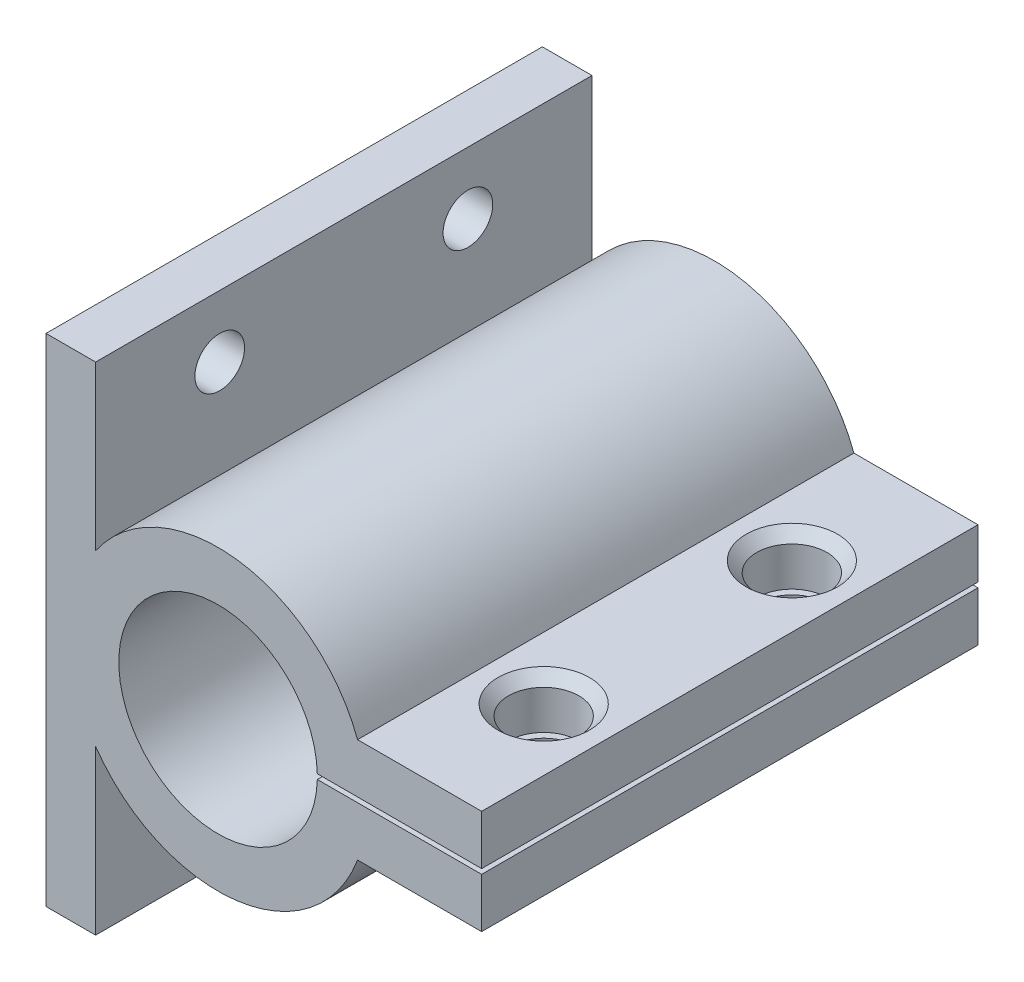
ISO-10303-21;
HEADER;
FILE_DESCRIPTION(('STEP AP214'),'2;1');
FILE_NAME('part.step','',(''),(''),'','','');
FILE_SCHEMA(('AUTOMOTIVE_DESIGN { 1 0 10303 214 1 1 1 1 }'));
ENDSEC;
DATA;
#1=APPLICATION_CONTEXT('core data for automotive mechanical design processes');
#2=APPLICATION_PROTOCOL_DEFINITION('international standard','automotive_design',2000,#1);
#3=PRODUCT_CONTEXT('',#1,'mechanical');
#4=PRODUCT('Part','Part','',(#3));
#5=PRODUCT_RELATED_PRODUCT_CATEGORY('part','',(#4));
#6=PRODUCT_DEFINITION_FORMATION('','',#4);
#7=PRODUCT_DEFINITION_CONTEXT('part definition',#1,'design');
#8=PRODUCT_DEFINITION('design','',#6,#7);
#9=PRODUCT_DEFINITION_SHAPE('','',#8);
#10=(LENGTH_UNIT() NAMED_UNIT(*) SI_UNIT(.MILLI.,.METRE.));
#11=(NAMED_UNIT(*) PLANE_ANGLE_UNIT() SI_UNIT($,.RADIAN.));
#12=(NAMED_UNIT(*) SI_UNIT($,.STERADIAN.) SOLID_ANGLE_UNIT());
#13=UNCERTAINTY_MEASURE_WITH_UNIT(LENGTH_MEASURE(1.E-05),#10,'distance_accuracy_value','');
#14=(GEOMETRIC_REPRESENTATION_CONTEXT(3) GLOBAL_UNCERTAINTY_ASSIGNED_CONTEXT((#13)) GLOBAL_UNIT_ASSIGNED_CONTEXT((#10,
#11,#12)) REPRESENTATION_CONTEXT('',''));
#15=CARTESIAN_POINT('',(0.,0.,0.));
#16=DIRECTION('',(0.,0.,1.));
#17=DIRECTION('',(1.,0.,0.));
#18=AXIS2_PLACEMENT_3D('',#15,#16,#17);
#19=CARTESIAN_POINT('',(-13.5159969824628,2.81896498367769,60.));
#20=DIRECTION('',(0.,0.,-1.));
#21=DIRECTION('',(-1.,0.,0.));
#22=AXIS2_PLACEMENT_3D('',#19,#20,#21);
#23=CYLINDRICAL_SURFACE('',#22,18.);
#24=CARTESIAN_POINT('',(-13.5159969824628,2.81896498367769,0.));
#25=DIRECTION('',(0.,0.,1.));
#26=DIRECTION('',(1.,0.,0.));
#27=AXIS2_PLACEMENT_3D('',#24,#25,#26);
#28=CIRCLE('',#27,18.);
#29=CARTESIAN_POINT('',(-28.3169253298772,-7.42469256891088,0.));
#30=VERTEX_POINT('',#29);
#31=CARTESIAN_POINT('',(3.34549761321287,-3.48103501632231,0.));
#32=VERTEX_POINT('',#31);
#33=EDGE_CURVE('E171',#30,#32,#28,.T.);
#34=ORIENTED_EDGE('',*,*,#33,.T.);
#35=DIRECTION('',(0.,0.,-1.));
#36=VECTOR('',#35,1.);
#37=CARTESIAN_POINT('',(3.34549761321287,-3.48103501632231,60.));
#38=LINE('',#37,#36);
#39=CARTESIAN_POINT('',(3.34549761321287,-3.48103501632231,60.));
#40=VERTEX_POINT('',#39);
#41=EDGE_CURVE('E11',#40,#32,#38,.T.);
#42=ORIENTED_EDGE('',*,*,#41,.F.);
#43=CARTESIAN_POINT('',(-13.5159969824628,2.81896498367769,60.));
#44=DIRECTION('',(0.,0.,1.));
#45=DIRECTION('',(1.,0.,0.));
#46=AXIS2_PLACEMENT_3D('',#43,#44,#45);
#47=CIRCLE('',#46,18.);
#48=CARTESIAN_POINT('',(-28.3169253298772,-7.42469256891088,60.));
#49=VERTEX_POINT('',#48);
#50=EDGE_CURVE('E198',#49,#40,#47,.T.);
#51=ORIENTED_EDGE('',*,*,#50,.F.);
#52=DIRECTION('',(0.,0.,-1.));
#53=VECTOR('',#52,1.);
#54=CARTESIAN_POINT('',(-28.3169253298772,-7.42469256891088,60.));
#55=LINE('',#54,#53);
#56=EDGE_CURVE('E167',#49,#30,#55,.T.);
#57=ORIENTED_EDGE('',*,*,#56,.T.);
#58=EDGE_LOOP('',(#34,#42,#51,#57));
#59=FACE_BOUND('',#58,.T.);
#60=ADVANCED_FACE('F37',(#59),#23,.T.);
#61=CARTESIAN_POINT('',(3.34549761321287,-3.48103501632231,60.));
#62=DIRECTION('',(0.,1.,0.));
#63=DIRECTION('',(0.,0.,1.));
#64=AXIS2_PLACEMENT_3D('',#61,#62,#63);
#65=PLANE('',#64);
#66=CARTESIAN_POINT('',(10.8454976132129,-3.48103501632231,15.));
#67=DIRECTION('',(0.,1.,0.));
#68=DIRECTION('',(0.,0.,1.));
#69=AXIS2_PLACEMENT_3D('',#66,#67,#68);
#70=CIRCLE('',#69,4.25);
#71=CARTESIAN_POINT('',(10.8454976132129,-3.48103501632231,19.25));
#72=VERTEX_POINT('',#71);
#73=EDGE_CURVE('E424',#72,#72,#70,.T.);
#74=ORIENTED_EDGE('',*,*,#73,.T.);
#75=EDGE_LOOP('',(#74));
#76=FACE_BOUND('',#75,.T.);
#77=CARTESIAN_POINT('',(10.8454976132129,-3.48103501632231,45.));
#78=DIRECTION('',(0.,1.,0.));
#79=DIRECTION('',(0.,0.,1.));
#80=AXIS2_PLACEMENT_3D('',#77,#78,#79);
#81=CIRCLE('',#80,4.25);
#82=CARTESIAN_POINT('',(10.8454976132129,-3.48103501632231,49.25));
#83=VERTEX_POINT('',#82);
#84=EDGE_CURVE('E234',#83,#83,#81,.T.);
#85=ORIENTED_EDGE('',*,*,#84,.T.);
#86=EDGE_LOOP('',(#85));
#87=FACE_BOUND('',#86,.T.);
#88=DIRECTION('',(1.,0.,0.));
#89=VECTOR('',#88,1.);
#90=CARTESIAN_POINT('',(3.34549761321287,-3.48103501632231,0.));
#91=LINE('',#90,#89);
#92=CARTESIAN_POINT('',(18.3454976132128,-3.48103501632231,0.));
#93=VERTEX_POINT('',#92);
#94=EDGE_CURVE('E174',#32,#93,#91,.T.);
#95=ORIENTED_EDGE('',*,*,#94,.T.);
#96=DIRECTION('',(0.,0.,-1.));
#97=VECTOR('',#96,1.);
#98=CARTESIAN_POINT('',(18.3454976132128,-3.48103501632231,60.));
#99=LINE('',#98,#97);
#100=CARTESIAN_POINT('',(18.3454976132128,-3.48103501632231,60.));
#101=VERTEX_POINT('',#100);
#102=EDGE_CURVE('E46',#101,#93,#99,.T.);
#103=ORIENTED_EDGE('',*,*,#102,.F.);
#104=DIRECTION('',(1.,0.,0.));
#105=VECTOR('',#104,1.);
#106=CARTESIAN_POINT('',(3.34549761321287,-3.48103501632231,60.));
#107=LINE('',#106,#105);
#108=EDGE_CURVE('E116',#40,#101,#107,.T.);
#109=ORIENTED_EDGE('',*,*,#108,.F.);
#110=ORIENTED_EDGE('',*,*,#41,.T.);
#111=EDGE_LOOP('',(#95,#103,#109,#110));
#112=FACE_BOUND('',#111,.T.);
#113=ADVANCED_FACE('F318',(#76,#87,#112),#65,.F.);
#114=CARTESIAN_POINT('',(18.3454976132128,-3.48103501632231,60.));
#115=DIRECTION('',(-1.,0.,0.));
#116=DIRECTION('',(0.,-1.,0.));
#117=AXIS2_PLACEMENT_3D('',#114,#115,#116);
#118=PLANE('',#117);
#119=DIRECTION('',(0.,1.,0.));
#120=VECTOR('',#119,1.);
#121=CARTESIAN_POINT('',(18.3454976132128,-3.48103501632231,0.));
#122=LINE('',#121,#120);
#123=CARTESIAN_POINT('',(18.3454976132129,2.5189649836777,0.));
#124=VERTEX_POINT('',#123);
#125=EDGE_CURVE('E177',#93,#124,#122,.T.);
#126=ORIENTED_EDGE('',*,*,#125,.T.);
#127=DIRECTION('',(0.,0.,-1.));
#128=VECTOR('',#127,1.);
#129=CARTESIAN_POINT('',(18.3454976132129,2.5189649836777,60.));
#130=LINE('',#129,#128);
#131=CARTESIAN_POINT('',(18.3454976132129,2.5189649836777,60.));
#132=VERTEX_POINT('',#131);
#133=EDGE_CURVE('E223',#132,#124,#130,.T.);
#134=ORIENTED_EDGE('',*,*,#133,.F.);
#135=DIRECTION('',(0.,1.,0.));
#136=VECTOR('',#135,1.);
#137=CARTESIAN_POINT('',(18.3454976132128,-3.48103501632231,60.));
#138=LINE('',#137,#136);
#139=EDGE_CURVE('E273',#101,#132,#138,.T.);
#140=ORIENTED_EDGE('',*,*,#139,.F.);
#141=ORIENTED_EDGE('',*,*,#102,.T.);
#142=EDGE_LOOP('',(#126,#134,#140,#141));
#143=FACE_BOUND('',#142,.T.);
#144=ADVANCED_FACE('F322',(#143),#118,.F.);
#145=CARTESIAN_POINT('',(18.3454976132129,2.5189649836777,60.));
#146=DIRECTION('',(0.,-1.,0.));
#147=DIRECTION('',(1.,0.,0.));
#148=AXIS2_PLACEMENT_3D('',#145,#146,#147);
#149=PLANE('',#148);
#150=CARTESIAN_POINT('',(10.8454976132129,2.51896498367769,15.));
#151=DIRECTION('',(0.,-1.,0.));
#152=DIRECTION('',(1.,0.,0.));
#153=AXIS2_PLACEMENT_3D('',#150,#151,#152);
#154=CIRCLE('',#153,4.25);
#155=CARTESIAN_POINT('',(15.0954976132129,2.51896498367769,15.));
#156=VERTEX_POINT('',#155);
#157=EDGE_CURVE('E40',#156,#156,#154,.T.);
#158=ORIENTED_EDGE('',*,*,#157,.T.);
#159=EDGE_LOOP('',(#158));
#160=FACE_BOUND('',#159,.T.);
#161=CARTESIAN_POINT('',(10.8454976132129,2.51896498367769,45.));
#162=DIRECTION('',(0.,-1.,0.));
#163=DIRECTION('',(1.,0.,0.));
#164=AXIS2_PLACEMENT_3D('',#161,#162,#163);
#165=CIRCLE('',#164,4.25);
#166=CARTESIAN_POINT('',(15.0954976132129,2.51896498367769,45.));
#167=VERTEX_POINT('',#166);
#168=EDGE_CURVE('E229',#167,#167,#165,.T.);
#169=ORIENTED_EDGE('',*,*,#168,.T.);
#170=EDGE_LOOP('',(#169));
#171=FACE_BOUND('',#170,.T.);
#172=DIRECTION('',(-1.,0.,0.));
#173=VECTOR('',#172,1.);
#174=CARTESIAN_POINT('',(18.3454976132129,2.5189649836777,0.));
#175=LINE('',#174,#173);
#176=CARTESIAN_POINT('',(-1.51974756858349,2.51896498367769,0.));
#177=VERTEX_POINT('',#176);
#178=EDGE_CURVE('E179',#124,#177,#175,.T.);
#179=ORIENTED_EDGE('',*,*,#178,.T.);
#180=DIRECTION('',(0.,0.,-1.));
#181=VECTOR('',#180,1.);
#182=CARTESIAN_POINT('',(-1.51974756858349,2.51896498367769,60.));
#183=LINE('',#182,#181);
#184=CARTESIAN_POINT('',(-1.51974756858349,2.51896498367769,60.));
#185=VERTEX_POINT('',#184);
#186=EDGE_CURVE('E220',#185,#177,#183,.T.);
#187=ORIENTED_EDGE('',*,*,#186,.F.);
#188=DIRECTION('',(-1.,0.,0.));
#189=VECTOR('',#188,1.);
#190=CARTESIAN_POINT('',(18.3454976132129,2.5189649836777,60.));
#191=LINE('',#190,#189);
#192=EDGE_CURVE('E275',#132,#185,#191,.T.);
#193=ORIENTED_EDGE('',*,*,#192,.F.);
#194=ORIENTED_EDGE('',*,*,#133,.T.);
#195=EDGE_LOOP('',(#179,#187,#193,#194));
#196=FACE_BOUND('',#195,.T.);
#197=ADVANCED_FACE('F327',(#160,#171,#196),#149,.F.);
#198=CARTESIAN_POINT('',(-13.5159969824628,2.81896498367769,60.));
#199=DIRECTION('',(0.,0.,-1.));
#200=DIRECTION('',(-1.,0.,0.));
#201=AXIS2_PLACEMENT_3D('',#198,#199,#200);
#202=CYLINDRICAL_SURFACE('',#201,12.);
#203=CARTESIAN_POINT('',(-13.5159969824628,2.81896498367769,0.));
#204=DIRECTION('',(0.,0.,-1.));
#205=DIRECTION('',(1.,0.,0.));
#206=AXIS2_PLACEMENT_3D('',#203,#204,#205);
#207=CIRCLE('',#206,12.);
#208=CARTESIAN_POINT('',(-1.51974756858349,3.11896498367769,0.));
#209=VERTEX_POINT('',#208);
#210=EDGE_CURVE('E181',#177,#209,#207,.T.);
#211=ORIENTED_EDGE('',*,*,#210,.T.);
#212=DIRECTION('',(0.,0.,-1.));
#213=VECTOR('',#212,1.);
#214=CARTESIAN_POINT('',(-1.51974756858349,3.11896498367769,60.));
#215=LINE('',#214,#213);
#216=CARTESIAN_POINT('',(-1.51974756858349,3.11896498367769,60.));
#217=VERTEX_POINT('',#216);
#218=EDGE_CURVE('E217',#217,#209,#215,.T.);
#219=ORIENTED_EDGE('',*,*,#218,.F.);
#220=CARTESIAN_POINT('',(-13.5159969824628,2.81896498367769,60.));
#221=DIRECTION('',(0.,0.,-1.));
#222=DIRECTION('',(1.,0.,0.));
#223=AXIS2_PLACEMENT_3D('',#220,#221,#222);
#224=CIRCLE('',#223,12.);
#225=EDGE_CURVE('E277',#185,#217,#224,.T.);
#226=ORIENTED_EDGE('',*,*,#225,.F.);
#227=ORIENTED_EDGE('',*,*,#186,.T.);
#228=EDGE_LOOP('',(#211,#219,#226,#227));
#229=FACE_BOUND('',#228,.T.);
#230=ADVANCED_FACE('F335',(#229),#202,.F.);
#231=CARTESIAN_POINT('',(18.3454976132129,3.11896498367769,60.));
#232=DIRECTION('',(0.,1.,0.));
#233=DIRECTION('',(-1.,0.,0.));
#234=AXIS2_PLACEMENT_3D('',#231,#232,#233);
#235=PLANE('',#234);
#236=CARTESIAN_POINT('',(10.8454976132129,3.11896498367769,15.));
#237=DIRECTION('',(0.,1.,0.));
#238=DIRECTION('',(-1.,0.,0.));
#239=AXIS2_PLACEMENT_3D('',#236,#237,#238);
#240=CIRCLE('',#239,4.25);
#241=CARTESIAN_POINT('',(6.59549761321287,3.11896498367769,15.));
#242=VERTEX_POINT('',#241);
#243=EDGE_CURVE('E242',#242,#242,#240,.T.);
#244=ORIENTED_EDGE('',*,*,#243,.T.);
#245=EDGE_LOOP('',(#244));
#246=FACE_BOUND('',#245,.T.);
#247=CARTESIAN_POINT('',(10.8454976132129,3.11896498367769,45.));
#248=DIRECTION('',(0.,1.,0.));
#249=DIRECTION('',(-1.,0.,0.));
#250=AXIS2_PLACEMENT_3D('',#247,#248,#249);
#251=CIRCLE('',#250,4.25);
#252=CARTESIAN_POINT('',(6.59549761321287,3.11896498367769,45.));
#253=VERTEX_POINT('',#252);
#254=EDGE_CURVE('E227',#253,#253,#251,.T.);
#255=ORIENTED_EDGE('',*,*,#254,.T.);
#256=EDGE_LOOP('',(#255));
#257=FACE_BOUND('',#256,.T.);
#258=DIRECTION('',(1.,0.,0.));
#259=VECTOR('',#258,1.);
#260=CARTESIAN_POINT('',(18.3454976132129,3.11896498367769,0.));
#261=LINE('',#260,#259);
#262=CARTESIAN_POINT('',(18.3454976132129,3.11896498367769,0.));
#263=VERTEX_POINT('',#262);
#264=EDGE_CURVE('E183',#209,#263,#261,.T.);
#265=ORIENTED_EDGE('',*,*,#264,.T.);
#266=DIRECTION('',(0.,0.,-1.));
#267=VECTOR('',#266,1.);
#268=CARTESIAN_POINT('',(18.3454976132129,3.11896498367769,60.));
#269=LINE('',#268,#267);
#270=CARTESIAN_POINT('',(18.3454976132129,3.11896498367769,60.));
#271=VERTEX_POINT('',#270);
#272=EDGE_CURVE('E214',#271,#263,#269,.T.);
#273=ORIENTED_EDGE('',*,*,#272,.F.);
#274=DIRECTION('',(1.,0.,0.));
#275=VECTOR('',#274,1.);
#276=CARTESIAN_POINT('',(18.3454976132129,3.11896498367769,60.));
#277=LINE('',#276,#275);
#278=EDGE_CURVE('E279',#217,#271,#277,.T.);
#279=ORIENTED_EDGE('',*,*,#278,.F.);
#280=ORIENTED_EDGE('',*,*,#218,.T.);
#281=EDGE_LOOP('',(#265,#273,#279,#280));
#282=FACE_BOUND('',#281,.T.);
#283=ADVANCED_FACE('F339',(#246,#257,#282),#235,.F.);
#284=CARTESIAN_POINT('',(18.3454976132129,9.1189649836777,60.));
#285=DIRECTION('',(-1.,0.,0.));
#286=DIRECTION('',(0.,-1.,0.));
#287=AXIS2_PLACEMENT_3D('',#284,#285,#286);
#288=PLANE('',#287);
#289=DIRECTION('',(0.,1.,0.));
#290=VECTOR('',#289,1.);
#291=CARTESIAN_POINT('',(18.3454976132129,9.1189649836777,0.));
#292=LINE('',#291,#290);
#293=CARTESIAN_POINT('',(18.3454976132129,9.1189649836777,0.));
#294=VERTEX_POINT('',#293);
#295=EDGE_CURVE('E185',#263,#294,#292,.T.);
#296=ORIENTED_EDGE('',*,*,#295,.T.);
#297=DIRECTION('',(0.,0.,-1.));
#298=VECTOR('',#297,1.);
#299=CARTESIAN_POINT('',(18.3454976132129,9.1189649836777,60.));
#300=LINE('',#299,#298);
#301=CARTESIAN_POINT('',(18.3454976132129,9.1189649836777,60.));
#302=VERTEX_POINT('',#301);
#303=EDGE_CURVE('E211',#302,#294,#300,.T.);
#304=ORIENTED_EDGE('',*,*,#303,.F.);
#305=DIRECTION('',(0.,1.,0.));
#306=VECTOR('',#305,1.);
#307=CARTESIAN_POINT('',(18.3454976132129,9.1189649836777,60.));
#308=LINE('',#307,#306);
#309=EDGE_CURVE('E281',#271,#302,#308,.T.);
#310=ORIENTED_EDGE('',*,*,#309,.F.);
#311=ORIENTED_EDGE('',*,*,#272,.T.);
#312=EDGE_LOOP('',(#296,#304,#310,#311));
#313=FACE_BOUND('',#312,.T.);
#314=ADVANCED_FACE('F343',(#313),#288,.F.);
#315=CARTESIAN_POINT('',(3.34549761321287,9.11896498367769,60.));
#316=DIRECTION('',(0.,-1.,0.));
#317=DIRECTION('',(1.,0.,0.));
#318=AXIS2_PLACEMENT_3D('',#315,#316,#317);
#319=PLANE('',#318);
#320=CARTESIAN_POINT('',(10.8454976132129,9.11896498367769,15.));
#321=DIRECTION('',(0.,1.,0.));
#322=DIRECTION('',(0.,0.,1.));
#323=AXIS2_PLACEMENT_3D('',#320,#321,#322);
#324=CIRCLE('',#323,5.525);
#325=CARTESIAN_POINT('',(10.8454976132129,9.11896498367769,20.525));
#326=VERTEX_POINT('',#325);
#327=EDGE_CURVE('E420',#326,#326,#324,.T.);
#328=ORIENTED_EDGE('',*,*,#327,.F.);
#329=EDGE_LOOP('',(#328));
#330=FACE_BOUND('',#329,.T.);
#331=CARTESIAN_POINT('',(10.8454976132129,9.11896498367769,45.));
#332=DIRECTION('',(0.,1.,0.));
#333=DIRECTION('',(0.,0.,1.));
#334=AXIS2_PLACEMENT_3D('',#331,#332,#333);
#335=CIRCLE('',#334,5.525);
#336=CARTESIAN_POINT('',(10.8454976132129,9.11896498367769,50.525));
#337=VERTEX_POINT('',#336);
#338=EDGE_CURVE('E237',#337,#337,#335,.T.);
#339=ORIENTED_EDGE('',*,*,#338,.F.);
#340=EDGE_LOOP('',(#339));
#341=FACE_BOUND('',#340,.T.);
#342=DIRECTION('',(-1.,0.,0.));
#343=VECTOR('',#342,1.);
#344=CARTESIAN_POINT('',(3.34549761321287,9.11896498367769,0.));
#345=LINE('',#344,#343);
#346=CARTESIAN_POINT('',(3.34549761321287,9.11896498367769,0.));
#347=VERTEX_POINT('',#346);
#348=EDGE_CURVE('E187',#294,#347,#345,.T.);
#349=ORIENTED_EDGE('',*,*,#348,.T.);
#350=DIRECTION('',(0.,0.,-1.));
#351=VECTOR('',#350,1.);
#352=CARTESIAN_POINT('',(3.34549761321287,9.11896498367769,60.));
#353=LINE('',#352,#351);
#354=CARTESIAN_POINT('',(3.34549761321287,9.11896498367769,60.));
#355=VERTEX_POINT('',#354);
#356=EDGE_CURVE('E208',#355,#347,#353,.T.);
#357=ORIENTED_EDGE('',*,*,#356,.F.);
#358=DIRECTION('',(-1.,0.,0.));
#359=VECTOR('',#358,1.);
#360=CARTESIAN_POINT('',(3.34549761321287,9.11896498367769,60.));
#361=LINE('',#360,#359);
#362=EDGE_CURVE('E283',#302,#355,#361,.T.);
#363=ORIENTED_EDGE('',*,*,#362,.F.);
#364=ORIENTED_EDGE('',*,*,#303,.T.);
#365=EDGE_LOOP('',(#349,#357,#363,#364));
#366=FACE_BOUND('',#365,.T.);
#367=ADVANCED_FACE('F347',(#330,#341,#366),#319,.F.);
#368=CARTESIAN_POINT('',(-13.5159969824628,2.81896498367769,60.));
#369=DIRECTION('',(0.,0.,-1.));
#370=DIRECTION('',(-1.,0.,0.));
#371=AXIS2_PLACEMENT_3D('',#368,#369,#370);
#372=CYLINDRICAL_SURFACE('',#371,18.);
#373=CARTESIAN_POINT('',(-13.5159969824628,2.81896498367769,0.));
#374=DIRECTION('',(0.,0.,1.));
#375=DIRECTION('',(-1.,0.,0.));
#376=AXIS2_PLACEMENT_3D('',#373,#374,#375);
#377=CIRCLE('',#376,18.);
#378=CARTESIAN_POINT('',(-28.3169253298772,13.0626225362663,0.));
#379=VERTEX_POINT('',#378);
#380=EDGE_CURVE('E189',#347,#379,#377,.T.);
#381=ORIENTED_EDGE('',*,*,#380,.T.);
#382=DIRECTION('',(0.,0.,-1.));
#383=VECTOR('',#382,1.);
#384=CARTESIAN_POINT('',(-28.3169253298772,13.0626225362663,60.));
#385=LINE('',#384,#383);
#386=CARTESIAN_POINT('',(-28.3169253298772,13.0626225362663,60.));
#387=VERTEX_POINT('',#386);
#388=EDGE_CURVE('E205',#387,#379,#385,.T.);
#389=ORIENTED_EDGE('',*,*,#388,.F.);
#390=CARTESIAN_POINT('',(-13.5159969824628,2.81896498367769,60.));
#391=DIRECTION('',(0.,0.,1.));
#392=DIRECTION('',(-1.,0.,0.));
#393=AXIS2_PLACEMENT_3D('',#390,#391,#392);
#394=CIRCLE('',#393,18.);
#395=EDGE_CURVE('E285',#355,#387,#394,.T.);
#396=ORIENTED_EDGE('',*,*,#395,.F.);
#397=ORIENTED_EDGE('',*,*,#356,.T.);
#398=EDGE_LOOP('',(#381,#389,#396,#397));
#399=FACE_BOUND('',#398,.T.);
#400=ADVANCED_FACE('F351',(#399),#372,.T.);
#401=CARTESIAN_POINT('',(-28.3169253298772,32.8189649836777,60.));
#402=DIRECTION('',(-1.,0.,0.));
#403=DIRECTION('',(0.,0.,1.));
#404=AXIS2_PLACEMENT_3D('',#401,#402,#403);
#405=PLANE('',#404);
#406=CARTESIAN_POINT('',(-28.3169253298772,25.3189649836777,15.));
#407=DIRECTION('',(1.,0.,0.));
#408=DIRECTION('',(0.,0.,-1.));
#409=AXIS2_PLACEMENT_3D('',#406,#407,#408);
#410=CIRCLE('',#409,3.);
#411=CARTESIAN_POINT('',(-28.3169253298772,25.3189649836777,12.));
#412=VERTEX_POINT('',#411);
#413=EDGE_CURVE('E258',#412,#412,#410,.T.);
#414=ORIENTED_EDGE('',*,*,#413,.F.);
#415=EDGE_LOOP('',(#414));
#416=FACE_BOUND('',#415,.T.);
#417=CARTESIAN_POINT('',(-28.3169253298772,25.3189649836777,45.));
#418=DIRECTION('',(1.,0.,0.));
#419=DIRECTION('',(0.,0.,-1.));
#420=AXIS2_PLACEMENT_3D('',#417,#418,#419);
#421=CIRCLE('',#420,3.);
#422=CARTESIAN_POINT('',(-28.3169253298772,25.3189649836777,42.));
#423=VERTEX_POINT('',#422);
#424=EDGE_CURVE('E264',#423,#423,#421,.T.);
#425=ORIENTED_EDGE('',*,*,#424,.F.);
#426=EDGE_LOOP('',(#425));
#427=FACE_BOUND('',#426,.T.);
#428=DIRECTION('',(0.,1.,0.));
#429=VECTOR('',#428,1.);
#430=CARTESIAN_POINT('',(-28.3169253298772,32.8189649836777,0.));
#431=LINE('',#430,#429);
#432=CARTESIAN_POINT('',(-28.3169253298772,32.8189649836777,0.));
#433=VERTEX_POINT('',#432);
#434=EDGE_CURVE('E191',#379,#433,#431,.T.);
#435=ORIENTED_EDGE('',*,*,#434,.T.);
#436=DIRECTION('',(0.,0.,-1.));
#437=VECTOR('',#436,1.);
#438=CARTESIAN_POINT('',(-28.3169253298772,32.8189649836777,60.));
#439=LINE('',#438,#437);
#440=CARTESIAN_POINT('',(-28.3169253298772,32.8189649836777,60.));
#441=VERTEX_POINT('',#440);
#442=EDGE_CURVE('E202',#441,#433,#439,.T.);
#443=ORIENTED_EDGE('',*,*,#442,.F.);
#444=DIRECTION('',(0.,1.,0.));
#445=VECTOR('',#444,1.);
#446=CARTESIAN_POINT('',(-28.3169253298772,32.8189649836777,60.));
#447=LINE('',#446,#445);
#448=EDGE_CURVE('E287',#387,#441,#447,.T.);
#449=ORIENTED_EDGE('',*,*,#448,.F.);
#450=ORIENTED_EDGE('',*,*,#388,.T.);
#451=EDGE_LOOP('',(#435,#443,#449,#450));
#452=FACE_BOUND('',#451,.T.);
#453=ADVANCED_FACE('F293',(#416,#427,#452),#405,.F.);
#454=CARTESIAN_POINT('',(-34.3169253298772,32.8189649836777,60.));
#455=DIRECTION('',(0.,-1.,0.));
#456=DIRECTION('',(0.,0.,-1.));
#457=AXIS2_PLACEMENT_3D('',#454,#455,#456);
#458=PLANE('',#457);
#459=DIRECTION('',(-1.,0.,0.));
#460=VECTOR('',#459,1.);
#461=CARTESIAN_POINT('',(-34.3169253298772,32.8189649836777,0.));
#462=LINE('',#461,#460);
#463=CARTESIAN_POINT('',(-34.3169253298772,32.8189649836777,0.));
#464=VERTEX_POINT('',#463);
#465=EDGE_CURVE('E193',#433,#464,#462,.T.);
#466=ORIENTED_EDGE('',*,*,#465,.T.);
#467=DIRECTION('',(0.,0.,-1.));
#468=VECTOR('',#467,1.);
#469=CARTESIAN_POINT('',(-34.3169253298772,32.8189649836777,60.));
#470=LINE('',#469,#468);
#471=CARTESIAN_POINT('',(-34.3169253298772,32.8189649836777,60.));
#472=VERTEX_POINT('',#471);
#473=EDGE_CURVE('E162',#472,#464,#470,.T.);
#474=ORIENTED_EDGE('',*,*,#473,.F.);
#475=DIRECTION('',(-1.,0.,0.));
#476=VECTOR('',#475,1.);
#477=CARTESIAN_POINT('',(-34.3169253298772,32.8189649836777,60.));
#478=LINE('',#477,#476);
#479=EDGE_CURVE('E153',#441,#472,#478,.T.);
#480=ORIENTED_EDGE('',*,*,#479,.F.);
#481=ORIENTED_EDGE('',*,*,#442,.T.);
#482=EDGE_LOOP('',(#466,#474,#480,#481));
#483=FACE_BOUND('',#482,.T.);
#484=ADVANCED_FACE('F297',(#483),#458,.F.);
#485=CARTESIAN_POINT('',(-34.3169253298772,-27.1810350163223,60.));
#486=DIRECTION('',(1.,0.,0.));
#487=DIRECTION('',(0.,1.,0.));
#488=AXIS2_PLACEMENT_3D('',#485,#486,#487);
#489=PLANE('',#488);
#490=CARTESIAN_POINT('',(-34.3169253298772,-19.6810350163223,15.));
#491=DIRECTION('',(-1.,0.,0.));
#492=DIRECTION('',(0.,0.,-1.));
#493=AXIS2_PLACEMENT_3D('',#490,#491,#492);
#494=CIRCLE('',#493,3.);
#495=CARTESIAN_POINT('',(-34.3169253298772,-16.6810350163223,15.));
#496=VERTEX_POINT('',#495);
#497=EDGE_CURVE('E249',#496,#496,#494,.T.);
#498=ORIENTED_EDGE('',*,*,#497,.F.);
#499=EDGE_LOOP('',(#498));
#500=FACE_BOUND('',#499,.T.);
#501=CARTESIAN_POINT('',(-34.3169253298772,-19.6810350163223,45.));
#502=DIRECTION('',(-1.,0.,0.));
#503=DIRECTION('',(0.,0.,-1.));
#504=AXIS2_PLACEMENT_3D('',#501,#502,#503);
#505=CIRCLE('',#504,3.);
#506=CARTESIAN_POINT('',(-34.3169253298772,-16.6810350163223,45.));
#507=VERTEX_POINT('',#506);
#508=EDGE_CURVE('E255',#507,#507,#505,.T.);
#509=ORIENTED_EDGE('',*,*,#508,.F.);
#510=EDGE_LOOP('',(#509));
#511=FACE_BOUND('',#510,.T.);
#512=CARTESIAN_POINT('',(-34.3169253298772,25.3189649836777,15.));
#513=DIRECTION('',(1.,0.,0.));
#514=DIRECTION('',(0.,0.,-1.));
#515=AXIS2_PLACEMENT_3D('',#512,#513,#514);
#516=CIRCLE('',#515,3.);
#517=CARTESIAN_POINT('',(-34.3169253298772,25.3189649836777,12.));
#518=VERTEX_POINT('',#517);
#519=EDGE_CURVE('E261',#518,#518,#516,.T.);
#520=ORIENTED_EDGE('',*,*,#519,.T.);
#521=EDGE_LOOP('',(#520));
#522=FACE_BOUND('',#521,.T.);
#523=CARTESIAN_POINT('',(-34.3169253298772,25.3189649836777,45.));
#524=DIRECTION('',(1.,0.,0.));
#525=DIRECTION('',(0.,0.,-1.));
#526=AXIS2_PLACEMENT_3D('',#523,#524,#525);
#527=CIRCLE('',#526,3.);
#528=CARTESIAN_POINT('',(-34.3169253298772,25.3189649836777,42.));
#529=VERTEX_POINT('',#528);
#530=EDGE_CURVE('E175',#529,#529,#527,.T.);
#531=ORIENTED_EDGE('',*,*,#530,.T.);
#532=EDGE_LOOP('',(#531));
#533=FACE_BOUND('',#532,.T.);
#534=DIRECTION('',(0.,-1.,0.));
#535=VECTOR('',#534,1.);
#536=CARTESIAN_POINT('',(-34.3169253298772,-27.1810350163223,0.));
#537=LINE('',#536,#535);
#538=CARTESIAN_POINT('',(-34.3169253298772,-27.1810350163223,0.));
#539=VERTEX_POINT('',#538);
#540=EDGE_CURVE('E161',#464,#539,#537,.T.);
#541=ORIENTED_EDGE('',*,*,#540,.T.);
#542=DIRECTION('',(0.,0.,-1.));
#543=VECTOR('',#542,1.);
#544=CARTESIAN_POINT('',(-34.3169253298772,-27.1810350163223,60.));
#545=LINE('',#544,#543);
#546=CARTESIAN_POINT('',(-34.3169253298772,-27.1810350163223,60.));
#547=VERTEX_POINT('',#546);
#548=EDGE_CURVE('E158',#547,#539,#545,.T.);
#549=ORIENTED_EDGE('',*,*,#548,.F.);
#550=DIRECTION('',(0.,-1.,0.));
#551=VECTOR('',#550,1.);
#552=CARTESIAN_POINT('',(-34.3169253298772,-27.1810350163223,60.));
#553=LINE('',#552,#551);
#554=EDGE_CURVE('E147',#472,#547,#553,.T.);
#555=ORIENTED_EDGE('',*,*,#554,.F.);
#556=ORIENTED_EDGE('',*,*,#473,.T.);
#557=EDGE_LOOP('',(#541,#549,#555,#556));
#558=FACE_BOUND('',#557,.T.);
#559=ADVANCED_FACE('F159',(#500,#511,#522,#533,#558),#489,.F.);
#560=CARTESIAN_POINT('',(-34.3169253298772,-27.1810350163223,60.));
#561=DIRECTION('',(0.,1.,0.));
#562=DIRECTION('',(0.,0.,1.));
#563=AXIS2_PLACEMENT_3D('',#560,#561,#562);
#564=PLANE('',#563);
#565=DIRECTION('',(1.,0.,0.));
#566=VECTOR('',#565,1.);
#567=CARTESIAN_POINT('',(-34.3169253298772,-27.1810350163223,0.));
#568=LINE('',#567,#566);
#569=CARTESIAN_POINT('',(-28.3169253298772,-27.1810350163223,0.));
#570=VERTEX_POINT('',#569);
#571=EDGE_CURVE('E102',#539,#570,#568,.T.);
#572=ORIENTED_EDGE('',*,*,#571,.T.);
#573=DIRECTION('',(0.,0.,-1.));
#574=VECTOR('',#573,1.);
#575=CARTESIAN_POINT('',(-28.3169253298772,-27.1810350163223,60.));
#576=LINE('',#575,#574);
#577=CARTESIAN_POINT('',(-28.3169253298772,-27.1810350163223,60.));
#578=VERTEX_POINT('',#577);
#579=EDGE_CURVE('E163',#578,#570,#576,.T.);
#580=ORIENTED_EDGE('',*,*,#579,.F.);
#581=DIRECTION('',(1.,0.,0.));
#582=VECTOR('',#581,1.);
#583=CARTESIAN_POINT('',(-34.3169253298772,-27.1810350163223,60.));
#584=LINE('',#583,#582);
#585=EDGE_CURVE('E151',#547,#578,#584,.T.);
#586=ORIENTED_EDGE('',*,*,#585,.F.);
#587=ORIENTED_EDGE('',*,*,#548,.T.);
#588=EDGE_LOOP('',(#572,#580,#586,#587));
#589=FACE_BOUND('',#588,.T.);
#590=ADVANCED_FACE('F165',(#589),#564,.F.);
#591=CARTESIAN_POINT('',(-28.3169253298772,-27.1810350163223,60.));
#592=DIRECTION('',(-1.,0.,0.));
#593=DIRECTION('',(0.,-1.,0.));
#594=AXIS2_PLACEMENT_3D('',#591,#592,#593);
#595=PLANE('',#594);
#596=CARTESIAN_POINT('',(-28.3169253298772,-19.6810350163223,15.));
#597=DIRECTION('',(-1.,0.,0.));
#598=DIRECTION('',(0.,0.,-1.));
#599=AXIS2_PLACEMENT_3D('',#596,#597,#598);
#600=CIRCLE('',#599,3.);
#601=CARTESIAN_POINT('',(-28.3169253298772,-16.6810350163223,15.));
#602=VERTEX_POINT('',#601);
#603=EDGE_CURVE('E248',#602,#602,#600,.T.);
#604=ORIENTED_EDGE('',*,*,#603,.T.);
#605=EDGE_LOOP('',(#604));
#606=FACE_BOUND('',#605,.T.);
#607=CARTESIAN_POINT('',(-28.3169253298772,-19.6810350163223,45.));
#608=DIRECTION('',(-1.,0.,0.));
#609=DIRECTION('',(0.,0.,-1.));
#610=AXIS2_PLACEMENT_3D('',#607,#608,#609);
#611=CIRCLE('',#610,3.);
#612=CARTESIAN_POINT('',(-28.3169253298772,-16.6810350163223,45.));
#613=VERTEX_POINT('',#612);
#614=EDGE_CURVE('E252',#613,#613,#611,.T.);
#615=ORIENTED_EDGE('',*,*,#614,.T.);
#616=EDGE_LOOP('',(#615));
#617=FACE_BOUND('',#616,.T.);
#618=DIRECTION('',(0.,1.,0.));
#619=VECTOR('',#618,1.);
#620=CARTESIAN_POINT('',(-28.3169253298772,-27.1810350163223,0.));
#621=LINE('',#620,#619);
#622=EDGE_CURVE('E108',#570,#30,#621,.T.);
#623=ORIENTED_EDGE('',*,*,#622,.T.);
#624=ORIENTED_EDGE('',*,*,#56,.F.);
#625=DIRECTION('',(0.,1.,0.));
#626=VECTOR('',#625,1.);
#627=CARTESIAN_POINT('',(-28.3169253298772,-27.1810350163223,60.));
#628=LINE('',#627,#626);
#629=EDGE_CURVE('E55',#578,#49,#628,.T.);
#630=ORIENTED_EDGE('',*,*,#629,.F.);
#631=ORIENTED_EDGE('',*,*,#579,.T.);
#632=EDGE_LOOP('',(#623,#624,#630,#631));
#633=FACE_BOUND('',#632,.T.);
#634=ADVANCED_FACE('F305',(#606,#617,#633),#595,.F.);
#635=CARTESIAN_POINT('',(-13.5159969824628,2.81896498367769,60.));
#636=DIRECTION('',(0.,0.,1.));
#637=DIRECTION('',(1.,0.,0.));
#638=AXIS2_PLACEMENT_3D('',#635,#636,#637);
#639=PLANE('',#638);
#640=ORIENTED_EDGE('',*,*,#50,.T.);
#641=ORIENTED_EDGE('',*,*,#108,.T.);
#642=ORIENTED_EDGE('',*,*,#139,.T.);
#643=ORIENTED_EDGE('',*,*,#192,.T.);
#644=ORIENTED_EDGE('',*,*,#225,.T.);
#645=ORIENTED_EDGE('',*,*,#278,.T.);
#646=ORIENTED_EDGE('',*,*,#309,.T.);
#647=ORIENTED_EDGE('',*,*,#362,.T.);
#648=ORIENTED_EDGE('',*,*,#395,.T.);
#649=ORIENTED_EDGE('',*,*,#448,.T.);
#650=ORIENTED_EDGE('',*,*,#479,.T.);
#651=ORIENTED_EDGE('',*,*,#554,.T.);
#652=ORIENTED_EDGE('',*,*,#585,.T.);
#653=ORIENTED_EDGE('',*,*,#629,.T.);
#654=EDGE_LOOP('',(#640,#641,#642,#643,#644,#645,#646,#647,#648,#649,#650,#651,#652,#653));
#655=FACE_BOUND('',#654,.T.);
#656=ADVANCED_FACE('F149',(#655),#639,.T.);
#657=CARTESIAN_POINT('',(-13.5159969824628,2.81896498367769,0.));
#658=DIRECTION('',(0.,0.,1.));
#659=DIRECTION('',(1.,0.,0.));
#660=AXIS2_PLACEMENT_3D('',#657,#658,#659);
#661=PLANE('',#660);
#662=ORIENTED_EDGE('',*,*,#33,.F.);
#663=ORIENTED_EDGE('',*,*,#622,.F.);
#664=ORIENTED_EDGE('',*,*,#571,.F.);
#665=ORIENTED_EDGE('',*,*,#540,.F.);
#666=ORIENTED_EDGE('',*,*,#465,.F.);
#667=ORIENTED_EDGE('',*,*,#434,.F.);
#668=ORIENTED_EDGE('',*,*,#380,.F.);
#669=ORIENTED_EDGE('',*,*,#348,.F.);
#670=ORIENTED_EDGE('',*,*,#295,.F.);
#671=ORIENTED_EDGE('',*,*,#264,.F.);
#672=ORIENTED_EDGE('',*,*,#210,.F.);
#673=ORIENTED_EDGE('',*,*,#178,.F.);
#674=ORIENTED_EDGE('',*,*,#125,.F.);
#675=ORIENTED_EDGE('',*,*,#94,.F.);
#676=EDGE_LOOP('',(#662,#663,#664,#665,#666,#667,#668,#669,#670,#671,#672,#673,#674,#675));
#677=FACE_BOUND('',#676,.T.);
#678=ADVANCED_FACE('F300',(#677),#661,.F.);
#679=CARTESIAN_POINT('',(-34.3169253298772,25.3189649836777,45.));
#680=DIRECTION('',(1.,0.,0.));
#681=DIRECTION('',(0.,0.,-1.));
#682=AXIS2_PLACEMENT_3D('',#679,#680,#681);
#683=CYLINDRICAL_SURFACE('',#682,3.);
#684=ORIENTED_EDGE('',*,*,#530,.F.);
#685=EDGE_LOOP('',(#684));
#686=FACE_BOUND('',#685,.T.);
#687=ORIENTED_EDGE('',*,*,#424,.T.);
#688=EDGE_LOOP('',(#687));
#689=FACE_BOUND('',#688,.T.);
#690=ADVANCED_FACE('F373',(#686,#689),#683,.F.);
#691=CARTESIAN_POINT('',(-34.3169253298772,25.3189649836777,15.));
#692=DIRECTION('',(1.,0.,0.));
#693=DIRECTION('',(0.,0.,-1.));
#694=AXIS2_PLACEMENT_3D('',#691,#692,#693);
#695=CYLINDRICAL_SURFACE('',#694,3.);
#696=ORIENTED_EDGE('',*,*,#519,.F.);
#697=EDGE_LOOP('',(#696));
#698=FACE_BOUND('',#697,.T.);
#699=ORIENTED_EDGE('',*,*,#413,.T.);
#700=EDGE_LOOP('',(#699));
#701=FACE_BOUND('',#700,.T.);
#702=ADVANCED_FACE('F376',(#698,#701),#695,.F.);
#703=CARTESIAN_POINT('',(-34.3169253298772,-19.6810350163223,45.));
#704=DIRECTION('',(1.,0.,0.));
#705=DIRECTION('',(0.,1.,0.));
#706=AXIS2_PLACEMENT_3D('',#703,#704,#705);
#707=CYLINDRICAL_SURFACE('',#706,3.);
#708=CARTESIAN_POINT('',(-34.3169253298772,-16.6810350163223,45.));
#709=CARTESIAN_POINT('',(-34.2544253298772,-16.6810350163223,45.));
#710=CARTESIAN_POINT('',(-34.1919253298772,-16.6810350163223,45.));
#711=CARTESIAN_POINT('',(-34.0669253298772,-16.6810350163223,45.));
#712=CARTESIAN_POINT('',(-34.0044253298772,-16.6810350163223,45.));
#713=CARTESIAN_POINT('',(-33.8794253298772,-16.6810350163223,45.));
#714=CARTESIAN_POINT('',(-33.8169253298772,-16.6810350163223,45.));
#715=CARTESIAN_POINT('',(-33.6919253298772,-16.6810350163223,45.));
#716=CARTESIAN_POINT('',(-33.6294253298772,-16.6810350163223,45.));
#717=CARTESIAN_POINT('',(-33.5044253298772,-16.6810350163223,45.));
#718=CARTESIAN_POINT('',(-33.4419253298772,-16.6810350163223,45.));
#719=CARTESIAN_POINT('',(-33.3169253298772,-16.6810350163223,45.));
#720=CARTESIAN_POINT('',(-33.2544253298772,-16.6810350163223,45.));
#721=CARTESIAN_POINT('',(-33.1294253298772,-16.6810350163223,45.));
#722=CARTESIAN_POINT('',(-33.0669253298772,-16.6810350163223,45.));
#723=CARTESIAN_POINT('',(-32.9419253298772,-16.6810350163223,45.));
#724=CARTESIAN_POINT('',(-32.8794253298772,-16.6810350163223,45.));
#725=CARTESIAN_POINT('',(-32.7544253298772,-16.6810350163223,45.));
#726=CARTESIAN_POINT('',(-32.6919253298772,-16.6810350163223,45.));
#727=CARTESIAN_POINT('',(-32.5669253298772,-16.6810350163223,45.));
#728=CARTESIAN_POINT('',(-32.5044253298772,-16.6810350163223,45.));
#729=CARTESIAN_POINT('',(-32.3794253298772,-16.6810350163223,45.));
#730=CARTESIAN_POINT('',(-32.3169253298772,-16.6810350163223,45.));
#731=CARTESIAN_POINT('',(-32.1919253298772,-16.6810350163223,45.));
#732=CARTESIAN_POINT('',(-32.1294253298772,-16.6810350163223,45.));
#733=CARTESIAN_POINT('',(-32.0044253298772,-16.6810350163223,45.));
#734=CARTESIAN_POINT('',(-31.9419253298772,-16.6810350163223,45.));
#735=CARTESIAN_POINT('',(-31.8169253298772,-16.6810350163223,45.));
#736=CARTESIAN_POINT('',(-31.7544253298772,-16.6810350163223,45.));
#737=CARTESIAN_POINT('',(-31.6294253298772,-16.6810350163223,45.));
#738=CARTESIAN_POINT('',(-31.5669253298772,-16.6810350163223,45.));
#739=CARTESIAN_POINT('',(-31.4419253298772,-16.6810350163223,45.));
#740=CARTESIAN_POINT('',(-31.3794253298772,-16.6810350163223,45.));
#741=CARTESIAN_POINT('',(-31.2544253298772,-16.6810350163223,45.));
#742=CARTESIAN_POINT('',(-31.1919253298772,-16.6810350163223,45.));
#743=CARTESIAN_POINT('',(-31.0669253298772,-16.6810350163223,45.));
#744=CARTESIAN_POINT('',(-31.0044253298772,-16.6810350163223,45.));
#745=CARTESIAN_POINT('',(-30.8794253298772,-16.6810350163223,45.));
#746=CARTESIAN_POINT('',(-30.8169253298772,-16.6810350163223,45.));
#747=CARTESIAN_POINT('',(-30.6919253298772,-16.6810350163223,45.));
#748=CARTESIAN_POINT('',(-30.6294253298772,-16.6810350163223,45.));
#749=CARTESIAN_POINT('',(-30.5044253298772,-16.6810350163223,45.));
#750=CARTESIAN_POINT('',(-30.4419253298772,-16.6810350163223,45.));
#751=CARTESIAN_POINT('',(-30.3169253298772,-16.6810350163223,45.));
#752=CARTESIAN_POINT('',(-30.2544253298772,-16.6810350163223,45.));
#753=CARTESIAN_POINT('',(-30.1294253298772,-16.6810350163223,45.));
#754=CARTESIAN_POINT('',(-30.0669253298772,-16.6810350163223,45.));
#755=CARTESIAN_POINT('',(-29.9419253298772,-16.6810350163223,45.));
#756=CARTESIAN_POINT('',(-29.8794253298772,-16.6810350163223,45.));
#757=CARTESIAN_POINT('',(-29.7544253298772,-16.6810350163223,45.));
#758=CARTESIAN_POINT('',(-29.6919253298772,-16.6810350163223,45.));
#759=CARTESIAN_POINT('',(-29.5669253298772,-16.6810350163223,45.));
#760=CARTESIAN_POINT('',(-29.5044253298772,-16.6810350163223,45.));
#761=CARTESIAN_POINT('',(-29.3794253298772,-16.6810350163223,45.));
#762=CARTESIAN_POINT('',(-29.3169253298772,-16.6810350163223,45.));
#763=CARTESIAN_POINT('',(-29.1919253298772,-16.6810350163223,45.));
#764=CARTESIAN_POINT('',(-29.1294253298772,-16.6810350163223,45.));
#765=CARTESIAN_POINT('',(-29.0044253298772,-16.6810350163223,45.));
#766=CARTESIAN_POINT('',(-28.9419253298772,-16.6810350163223,45.));
#767=CARTESIAN_POINT('',(-28.8169253298772,-16.6810350163223,45.));
#768=CARTESIAN_POINT('',(-28.7544253298772,-16.6810350163223,45.));
#769=CARTESIAN_POINT('',(-28.6294253298772,-16.6810350163223,45.));
#770=CARTESIAN_POINT('',(-28.5669253298772,-16.6810350163223,45.));
#771=CARTESIAN_POINT('',(-28.4419253298772,-16.6810350163223,45.));
#772=CARTESIAN_POINT('',(-28.3794253298772,-16.6810350163223,45.));
#773=CARTESIAN_POINT('',(-28.3169253298772,-16.6810350163223,45.));
#774=B_SPLINE_CURVE_WITH_KNOTS('',3,(#708,#709,#710,#711,#712,#713,#714,#715,#716,#717,#718,
#719,#720,#721,#722,#723,#724,#725,#726,#727,#728,#729,#730,#731,#732,#733,#734,#735,#736,#737,
#738,#739,#740,#741,#742,#743,#744,#745,#746,#747,#748,#749,#750,#751,#752,#753,#754,#755,#756,
#757,#758,#759,#760,#761,#762,#763,#764,#765,#766,#767,#768,#769,#770,#771,#772,#773),
.UNSPECIFIED.,.F.,.F.,(4,2,2,2,2,2,2,2,2,2,2,2,2,2,2,2,2,2,2,2,2,2,2,2,2,2,2,2,2,2,2,2,4),(0.,
0.187500000000007,0.375000000000007,0.562500000000007,0.750000000000008,0.937500000000008,
1.12500000000001,1.31250000000001,1.50000000000001,1.68750000000001,1.87500000000001,2.0625,
2.25000000000001,2.43750000000001,2.62500000000001,2.81250000000001,3.00000000000001,
3.18750000000001,3.37500000000001,3.56250000000001,3.75000000000001,3.93750000000001,
4.12500000000001,4.31250000000001,4.50000000000001,4.68750000000001,4.87500000000001,
5.06250000000001,5.25000000000001,5.43750000000001,5.62500000000001,5.81250000000001,
6.00000000000001),.UNSPECIFIED.);
#775=EDGE_CURVE('BSEAM384',#507,#613,#774,.T.);
#776=ORIENTED_EDGE('',*,*,#508,.T.);
#777=ORIENTED_EDGE('',*,*,#614,.F.);
#778=ORIENTED_EDGE('',*,*,#775,.T.);
#779=ORIENTED_EDGE('',*,*,#775,.F.);
#780=EDGE_LOOP('',(#776,#778,#777,#779));
#781=FACE_BOUND('',#780,.T.);
#782=ADVANCED_FACE('F384',(#781),#707,.F.);
#783=CARTESIAN_POINT('',(-34.3169253298772,-19.6810350163223,15.));
#784=DIRECTION('',(1.,0.,0.));
#785=DIRECTION('',(0.,1.,0.));
#786=AXIS2_PLACEMENT_3D('',#783,#784,#785);
#787=CYLINDRICAL_SURFACE('',#786,3.);
#788=CARTESIAN_POINT('',(-34.3169253298772,-16.6810350163223,15.));
#789=CARTESIAN_POINT('',(-34.2544253298772,-16.6810350163223,15.));
#790=CARTESIAN_POINT('',(-34.1919253298772,-16.6810350163223,15.));
#791=CARTESIAN_POINT('',(-34.0669253298772,-16.6810350163223,15.));
#792=CARTESIAN_POINT('',(-34.0044253298772,-16.6810350163223,15.));
#793=CARTESIAN_POINT('',(-33.8794253298772,-16.6810350163223,15.));
#794=CARTESIAN_POINT('',(-33.8169253298772,-16.6810350163223,15.));
#795=CARTESIAN_POINT('',(-33.6919253298772,-16.6810350163223,15.));
#796=CARTESIAN_POINT('',(-33.6294253298772,-16.6810350163223,15.));
#797=CARTESIAN_POINT('',(-33.5044253298772,-16.6810350163223,15.));
#798=CARTESIAN_POINT('',(-33.4419253298772,-16.6810350163223,15.));
#799=CARTESIAN_POINT('',(-33.3169253298772,-16.6810350163223,15.));
#800=CARTESIAN_POINT('',(-33.2544253298772,-16.6810350163223,15.));
#801=CARTESIAN_POINT('',(-33.1294253298772,-16.6810350163223,15.));
#802=CARTESIAN_POINT('',(-33.0669253298772,-16.6810350163223,15.));
#803=CARTESIAN_POINT('',(-32.9419253298772,-16.6810350163223,15.));
#804=CARTESIAN_POINT('',(-32.8794253298772,-16.6810350163223,15.));
#805=CARTESIAN_POINT('',(-32.7544253298772,-16.6810350163223,15.));
#806=CARTESIAN_POINT('',(-32.6919253298772,-16.6810350163223,15.));
#807=CARTESIAN_POINT('',(-32.5669253298772,-16.6810350163223,15.));
#808=CARTESIAN_POINT('',(-32.5044253298772,-16.6810350163223,15.));
#809=CARTESIAN_POINT('',(-32.3794253298772,-16.6810350163223,15.));
#810=CARTESIAN_POINT('',(-32.3169253298772,-16.6810350163223,15.));
#811=CARTESIAN_POINT('',(-32.1919253298772,-16.6810350163223,15.));
#812=CARTESIAN_POINT('',(-32.1294253298772,-16.6810350163223,15.));
#813=CARTESIAN_POINT('',(-32.0044253298772,-16.6810350163223,15.));
#814=CARTESIAN_POINT('',(-31.9419253298772,-16.6810350163223,15.));
#815=CARTESIAN_POINT('',(-31.8169253298772,-16.6810350163223,15.));
#816=CARTESIAN_POINT('',(-31.7544253298772,-16.6810350163223,15.));
#817=CARTESIAN_POINT('',(-31.6294253298772,-16.6810350163223,15.));
#818=CARTESIAN_POINT('',(-31.5669253298772,-16.6810350163223,15.));
#819=CARTESIAN_POINT('',(-31.4419253298772,-16.6810350163223,15.));
#820=CARTESIAN_POINT('',(-31.3794253298772,-16.6810350163223,15.));
#821=CARTESIAN_POINT('',(-31.2544253298772,-16.6810350163223,15.));
#822=CARTESIAN_POINT('',(-31.1919253298772,-16.6810350163223,15.));
#823=CARTESIAN_POINT('',(-31.0669253298772,-16.6810350163223,15.));
#824=CARTESIAN_POINT('',(-31.0044253298772,-16.6810350163223,15.));
#825=CARTESIAN_POINT('',(-30.8794253298772,-16.6810350163223,15.));
#826=CARTESIAN_POINT('',(-30.8169253298772,-16.6810350163223,15.));
#827=CARTESIAN_POINT('',(-30.6919253298772,-16.6810350163223,15.));
#828=CARTESIAN_POINT('',(-30.6294253298772,-16.6810350163223,15.));
#829=CARTESIAN_POINT('',(-30.5044253298772,-16.6810350163223,15.));
#830=CARTESIAN_POINT('',(-30.4419253298772,-16.6810350163223,15.));
#831=CARTESIAN_POINT('',(-30.3169253298772,-16.6810350163223,15.));
#832=CARTESIAN_POINT('',(-30.2544253298772,-16.6810350163223,15.));
#833=CARTESIAN_POINT('',(-30.1294253298772,-16.6810350163223,15.));
#834=CARTESIAN_POINT('',(-30.0669253298772,-16.6810350163223,15.));
#835=CARTESIAN_POINT('',(-29.9419253298772,-16.6810350163223,15.));
#836=CARTESIAN_POINT('',(-29.8794253298772,-16.6810350163223,15.));
#837=CARTESIAN_POINT('',(-29.7544253298772,-16.6810350163223,15.));
#838=CARTESIAN_POINT('',(-29.6919253298772,-16.6810350163223,15.));
#839=CARTESIAN_POINT('',(-29.5669253298772,-16.6810350163223,15.));
#840=CARTESIAN_POINT('',(-29.5044253298772,-16.6810350163223,15.));
#841=CARTESIAN_POINT('',(-29.3794253298772,-16.6810350163223,15.));
#842=CARTESIAN_POINT('',(-29.3169253298772,-16.6810350163223,15.));
#843=CARTESIAN_POINT('',(-29.1919253298772,-16.6810350163223,15.));
#844=CARTESIAN_POINT('',(-29.1294253298772,-16.6810350163223,15.));
#845=CARTESIAN_POINT('',(-29.0044253298772,-16.6810350163223,15.));
#846=CARTESIAN_POINT('',(-28.9419253298772,-16.6810350163223,15.));
#847=CARTESIAN_POINT('',(-28.8169253298772,-16.6810350163223,15.));
#848=CARTESIAN_POINT('',(-28.7544253298772,-16.6810350163223,15.));
#849=CARTESIAN_POINT('',(-28.6294253298772,-16.6810350163223,15.));
#850=CARTESIAN_POINT('',(-28.5669253298772,-16.6810350163223,15.));
#851=CARTESIAN_POINT('',(-28.4419253298772,-16.6810350163223,15.));
#852=CARTESIAN_POINT('',(-28.3794253298772,-16.6810350163223,15.));
#853=CARTESIAN_POINT('',(-28.3169253298772,-16.6810350163223,15.));
#854=B_SPLINE_CURVE_WITH_KNOTS('',3,(#788,#789,#790,#791,#792,#793,#794,#795,#796,#797,#798,
#799,#800,#801,#802,#803,#804,#805,#806,#807,#808,#809,#810,#811,#812,#813,#814,#815,#816,#817,
#818,#819,#820,#821,#822,#823,#824,#825,#826,#827,#828,#829,#830,#831,#832,#833,#834,#835,#836,
#837,#838,#839,#840,#841,#842,#843,#844,#845,#846,#847,#848,#849,#850,#851,#852,#853),
.UNSPECIFIED.,.F.,.F.,(4,2,2,2,2,2,2,2,2,2,2,2,2,2,2,2,2,2,2,2,2,2,2,2,2,2,2,2,2,2,2,2,4),(0.,
0.187500000000007,0.375000000000007,0.562500000000007,0.750000000000008,0.937500000000008,
1.12500000000001,1.31250000000001,1.50000000000001,1.68750000000001,1.87500000000001,2.0625,
2.25000000000001,2.43750000000001,2.62500000000001,2.81250000000001,3.00000000000001,
3.18750000000001,3.37500000000001,3.56250000000001,3.75000000000001,3.93750000000001,
4.12500000000001,4.31250000000001,4.50000000000001,4.68750000000001,4.87500000000001,
5.06250000000001,5.25000000000001,5.43750000000001,5.62500000000001,5.81250000000001,
6.00000000000001),.UNSPECIFIED.);
#855=EDGE_CURVE('BSEAM390',#496,#602,#854,.T.);
#856=ORIENTED_EDGE('',*,*,#497,.T.);
#857=ORIENTED_EDGE('',*,*,#603,.F.);
#858=ORIENTED_EDGE('',*,*,#855,.T.);
#859=ORIENTED_EDGE('',*,*,#855,.F.);
#860=EDGE_LOOP('',(#856,#858,#857,#859));
#861=FACE_BOUND('',#860,.T.);
#862=ADVANCED_FACE('F390',(#861),#787,.F.);
#863=CARTESIAN_POINT('',(10.8454976132129,9.11896498367769,45.));
#864=DIRECTION('',(0.,1.,0.));
#865=DIRECTION('',(0.,0.,1.));
#866=AXIS2_PLACEMENT_3D('',#863,#864,#865);
#867=CYLINDRICAL_SURFACE('',#866,4.25);
#868=CARTESIAN_POINT('',(10.8454976132129,7.84396498367769,45.));
#869=DIRECTION('',(0.,1.,0.));
#870=DIRECTION('',(0.,0.,1.));
#871=AXIS2_PLACEMENT_3D('',#868,#869,#870);
#872=CIRCLE('',#871,4.25);
#873=CARTESIAN_POINT('',(10.8454976132129,7.84396498367769,49.25));
#874=VERTEX_POINT('',#873);
#875=EDGE_CURVE('E230',#874,#874,#872,.T.);
#876=ORIENTED_EDGE('',*,*,#875,.T.);
#877=EDGE_LOOP('',(#876));
#878=FACE_BOUND('',#877,.T.);
#879=ORIENTED_EDGE('',*,*,#254,.F.);
#880=EDGE_LOOP('',(#879));
#881=FACE_BOUND('',#880,.T.);
#882=ADVANCED_FACE('F394',(#878,#881),#867,.F.);
#883=CARTESIAN_POINT('',(10.8454976132129,9.11896498367769,45.));
#884=DIRECTION('',(0.,1.,0.));
#885=DIRECTION('',(0.,0.,1.));
#886=AXIS2_PLACEMENT_3D('',#883,#884,#885);
#887=CONICAL_SURFACE('',#886,5.525,0.785398163397451);
#888=ORIENTED_EDGE('',*,*,#875,.F.);
#889=EDGE_LOOP('',(#888));
#890=FACE_BOUND('',#889,.T.);
#891=ORIENTED_EDGE('',*,*,#338,.T.);
#892=EDGE_LOOP('',(#891));
#893=FACE_BOUND('',#892,.T.);
#894=ADVANCED_FACE('F400',(#890,#893),#887,.F.);
#895=ORIENTED_EDGE('',*,*,#168,.F.);
#896=EDGE_LOOP('',(#895));
#897=FACE_BOUND('',#896,.T.);
#898=ORIENTED_EDGE('',*,*,#84,.F.);
#899=EDGE_LOOP('',(#898));
#900=FACE_BOUND('',#899,.T.);
#901=ADVANCED_FACE('F396',(#897,#900),#867,.F.);
#902=CARTESIAN_POINT('',(10.8454976132129,9.11896498367769,15.));
#903=DIRECTION('',(0.,1.,0.));
#904=DIRECTION('',(0.,0.,1.));
#905=AXIS2_PLACEMENT_3D('',#902,#903,#904);
#906=CONICAL_SURFACE('',#905,5.525,0.785398163397451);
#907=CARTESIAN_POINT('',(10.8454976132129,7.84396498367769,15.));
#908=DIRECTION('',(0.,1.,0.));
#909=DIRECTION('',(0.,0.,1.));
#910=AXIS2_PLACEMENT_3D('',#907,#908,#909);
#911=CIRCLE('',#910,4.25);
#912=CARTESIAN_POINT('',(10.8454976132129,7.84396498367769,19.25));
#913=VERTEX_POINT('',#912);
#914=EDGE_CURVE('E417',#913,#913,#911,.T.);
#915=ORIENTED_EDGE('',*,*,#914,.F.);
#916=EDGE_LOOP('',(#915));
#917=FACE_BOUND('',#916,.T.);
#918=ORIENTED_EDGE('',*,*,#327,.T.);
#919=EDGE_LOOP('',(#918));
#920=FACE_BOUND('',#919,.T.);
#921=ADVANCED_FACE('F399',(#917,#920),#906,.F.);
#922=CARTESIAN_POINT('',(10.8454976132129,9.11896498367769,15.));
#923=DIRECTION('',(0.,1.,0.));
#924=DIRECTION('',(0.,0.,1.));
#925=AXIS2_PLACEMENT_3D('',#922,#923,#924);
#926=CYLINDRICAL_SURFACE('',#925,4.25);
#927=ORIENTED_EDGE('',*,*,#914,.T.);
#928=EDGE_LOOP('',(#927));
#929=FACE_BOUND('',#928,.T.);
#930=ORIENTED_EDGE('',*,*,#243,.F.);
#931=EDGE_LOOP('',(#930));
#932=FACE_BOUND('',#931,.T.);
#933=ADVANCED_FACE('F405',(#929,#932),#926,.F.);
#934=ORIENTED_EDGE('',*,*,#157,.F.);
#935=EDGE_LOOP('',(#934));
#936=FACE_BOUND('',#935,.T.);
#937=ORIENTED_EDGE('',*,*,#73,.F.);
#938=EDGE_LOOP('',(#937));
#939=FACE_BOUND('',#938,.T.);
#940=ADVANCED_FACE('F408',(#936,#939),#926,.F.);
#941=CLOSED_SHELL('',(#60,#113,#144,#197,#230,#283,#314,#367,#400,#453,#484,#559,#590,#634,#656,
#678,#690,#702,#782,#862,#882,#894,#901,#921,#933,#940));
#942=MANIFOLD_SOLID_BREP('B2',#941);
#943=ADVANCED_BREP_SHAPE_REPRESENTATION('',(#18,#942),#14);
#944=SHAPE_DEFINITION_REPRESENTATION(#9,#943);
ENDSEC;
END-ISO-10303-21;
